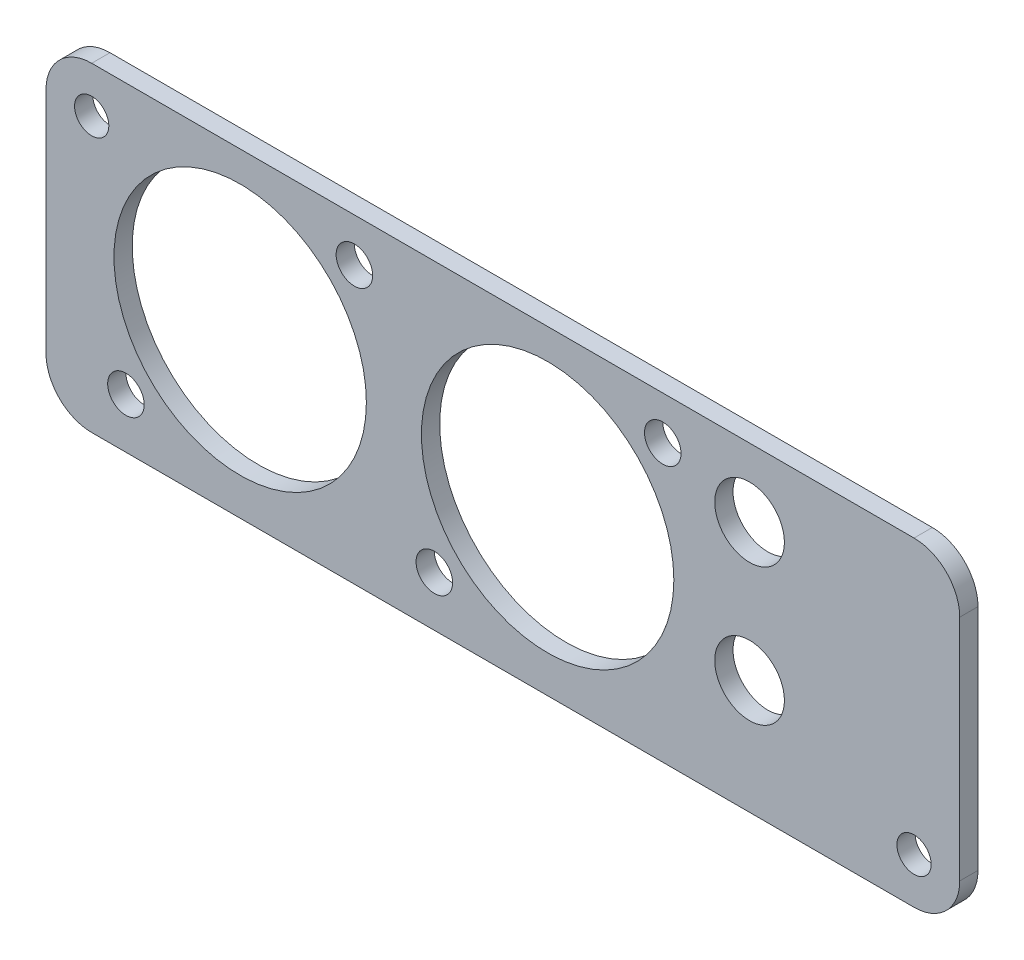
ISO-10303-21;
HEADER;
FILE_DESCRIPTION(('STEP AP214'),'2;1');
FILE_NAME('part.step','',(''),(''),'','','');
FILE_SCHEMA(('AUTOMOTIVE_DESIGN { 1 0 10303 214 1 1 1 1 }'));
ENDSEC;
DATA;
#1=APPLICATION_CONTEXT('core data for automotive mechanical design processes');
#2=APPLICATION_PROTOCOL_DEFINITION('international standard','automotive_design',2000,#1);
#3=PRODUCT_CONTEXT('',#1,'mechanical');
#4=PRODUCT('Part','Part','',(#3));
#5=PRODUCT_RELATED_PRODUCT_CATEGORY('part','',(#4));
#6=PRODUCT_DEFINITION_FORMATION('','',#4);
#7=PRODUCT_DEFINITION_CONTEXT('part definition',#1,'design');
#8=PRODUCT_DEFINITION('design','',#6,#7);
#9=PRODUCT_DEFINITION_SHAPE('','',#8);
#10=(LENGTH_UNIT() NAMED_UNIT(*) SI_UNIT(.MILLI.,.METRE.));
#11=(NAMED_UNIT(*) PLANE_ANGLE_UNIT() SI_UNIT($,.RADIAN.));
#12=(NAMED_UNIT(*) SI_UNIT($,.STERADIAN.) SOLID_ANGLE_UNIT());
#13=UNCERTAINTY_MEASURE_WITH_UNIT(LENGTH_MEASURE(1.E-05),#10,'distance_accuracy_value','');
#14=(GEOMETRIC_REPRESENTATION_CONTEXT(3) GLOBAL_UNCERTAINTY_ASSIGNED_CONTEXT((#13)) GLOBAL_UNIT_ASSIGNED_CONTEXT((#10,
#11,#12)) REPRESENTATION_CONTEXT('',''));
#15=CARTESIAN_POINT('',(0.,0.,0.));
#16=DIRECTION('',(0.,0.,1.));
#17=DIRECTION('',(1.,0.,0.));
#18=AXIS2_PLACEMENT_3D('',#15,#16,#17);
#19=CARTESIAN_POINT('',(-36.,-10.,1.6));
#20=DIRECTION('',(0.,0.,-1.));
#21=DIRECTION('',(-1.,0.,0.));
#22=AXIS2_PLACEMENT_3D('',#19,#20,#21);
#23=PLANE('',#22);
#24=CARTESIAN_POINT('',(-36.,-10.,1.6));
#25=DIRECTION('',(0.,0.,1.));
#26=DIRECTION('',(-1.,0.,0.));
#27=AXIS2_PLACEMENT_3D('',#24,#25,#26);
#28=CIRCLE('',#27,4.);
#29=CARTESIAN_POINT('',(-40.,-9.99999999999997,1.6));
#30=VERTEX_POINT('',#29);
#31=CARTESIAN_POINT('',(-36.,-14.,1.6));
#32=VERTEX_POINT('',#31);
#33=EDGE_CURVE('E151',#30,#32,#28,.T.);
#34=ORIENTED_EDGE('',*,*,#33,.T.);
#35=DIRECTION('',(1.,0.,0.));
#36=VECTOR('',#35,1.);
#37=CARTESIAN_POINT('',(-36.,-14.,1.6));
#38=LINE('',#37,#36);
#39=CARTESIAN_POINT('',(36.,-14.,1.6));
#40=VERTEX_POINT('',#39);
#41=EDGE_CURVE('E99',#32,#40,#38,.T.);
#42=ORIENTED_EDGE('',*,*,#41,.T.);
#43=CARTESIAN_POINT('',(36.,-10.,1.6));
#44=DIRECTION('',(0.,0.,1.));
#45=DIRECTION('',(1.,0.,0.));
#46=AXIS2_PLACEMENT_3D('',#43,#44,#45);
#47=CIRCLE('',#46,4.);
#48=CARTESIAN_POINT('',(40.,-10.,1.6));
#49=VERTEX_POINT('',#48);
#50=EDGE_CURVE('E166',#40,#49,#47,.T.);
#51=ORIENTED_EDGE('',*,*,#50,.T.);
#52=DIRECTION('',(0.,1.,0.));
#53=VECTOR('',#52,1.);
#54=CARTESIAN_POINT('',(40.,-9.99999999999997,1.6));
#55=LINE('',#54,#53);
#56=CARTESIAN_POINT('',(40.,9.99999999999997,1.6));
#57=VERTEX_POINT('',#56);
#58=EDGE_CURVE('E179',#49,#57,#55,.T.);
#59=ORIENTED_EDGE('',*,*,#58,.T.);
#60=CARTESIAN_POINT('',(36.,10.,1.6));
#61=DIRECTION('',(0.,0.,1.));
#62=DIRECTION('',(-1.,0.,0.));
#63=AXIS2_PLACEMENT_3D('',#60,#61,#62);
#64=CIRCLE('',#63,4.);
#65=CARTESIAN_POINT('',(36.,14.,1.6));
#66=VERTEX_POINT('',#65);
#67=EDGE_CURVE('E118',#57,#66,#64,.T.);
#68=ORIENTED_EDGE('',*,*,#67,.T.);
#69=DIRECTION('',(-1.,0.,0.));
#70=VECTOR('',#69,1.);
#71=CARTESIAN_POINT('',(-36.,14.,1.6));
#72=LINE('',#71,#70);
#73=CARTESIAN_POINT('',(-36.,14.,1.6));
#74=VERTEX_POINT('',#73);
#75=EDGE_CURVE('E112',#66,#74,#72,.T.);
#76=ORIENTED_EDGE('',*,*,#75,.T.);
#77=CARTESIAN_POINT('',(-36.,10.,1.6));
#78=DIRECTION('',(0.,0.,1.));
#79=DIRECTION('',(-1.,0.,0.));
#80=AXIS2_PLACEMENT_3D('',#77,#78,#79);
#81=CIRCLE('',#80,4.);
#82=CARTESIAN_POINT('',(-40.,9.99999999999997,1.6));
#83=VERTEX_POINT('',#82);
#84=EDGE_CURVE('E116',#74,#83,#81,.T.);
#85=ORIENTED_EDGE('',*,*,#84,.T.);
#86=DIRECTION('',(0.,-1.,0.));
#87=VECTOR('',#86,1.);
#88=CARTESIAN_POINT('',(-40.,-9.99999999999997,1.6));
#89=LINE('',#88,#87);
#90=EDGE_CURVE('E56',#83,#30,#89,.T.);
#91=ORIENTED_EDGE('',*,*,#90,.T.);
#92=EDGE_LOOP('',(#34,#42,#51,#59,#68,#76,#85,#91));
#93=FACE_BOUND('',#92,.T.);
#94=CARTESIAN_POINT('',(-23.,0.300000000000002,1.6));
#95=DIRECTION('',(0.,0.,1.));
#96=DIRECTION('',(1.,0.,0.));
#97=AXIS2_PLACEMENT_3D('',#94,#95,#96);
#98=CIRCLE('',#97,11.05);
#99=CARTESIAN_POINT('',(-11.95,0.300000000000002,1.6));
#100=VERTEX_POINT('',#99);
#101=EDGE_CURVE('E140',#100,#100,#98,.T.);
#102=ORIENTED_EDGE('',*,*,#101,.F.);
#103=EDGE_LOOP('',(#102));
#104=FACE_BOUND('',#103,.T.);
#105=CARTESIAN_POINT('',(3.91999999999999,0.300000000000002,1.6));
#106=DIRECTION('',(0.,0.,1.));
#107=DIRECTION('',(1.,0.,0.));
#108=AXIS2_PLACEMENT_3D('',#105,#106,#107);
#109=CIRCLE('',#108,11.05);
#110=CARTESIAN_POINT('',(14.97,0.300000000000002,1.6));
#111=VERTEX_POINT('',#110);
#112=EDGE_CURVE('E188',#111,#111,#109,.T.);
#113=ORIENTED_EDGE('',*,*,#112,.F.);
#114=EDGE_LOOP('',(#113));
#115=FACE_BOUND('',#114,.T.);
#116=CARTESIAN_POINT('',(14.,10.2,1.6));
#117=DIRECTION('',(0.,0.,1.));
#118=DIRECTION('',(1.,0.,0.));
#119=AXIS2_PLACEMENT_3D('',#116,#117,#118);
#120=CIRCLE('',#119,1.6);
#121=CARTESIAN_POINT('',(15.6,10.2,1.6));
#122=VERTEX_POINT('',#121);
#123=EDGE_CURVE('E194',#122,#122,#120,.T.);
#124=ORIENTED_EDGE('',*,*,#123,.F.);
#125=EDGE_LOOP('',(#124));
#126=FACE_BOUND('',#125,.T.);
#127=CARTESIAN_POINT('',(-6.00000000000001,-9.6,1.6));
#128=DIRECTION('',(0.,0.,1.));
#129=DIRECTION('',(1.,0.,0.));
#130=AXIS2_PLACEMENT_3D('',#127,#128,#129);
#131=CIRCLE('',#130,1.6);
#132=CARTESIAN_POINT('',(-4.40000000000001,-9.6,1.6));
#133=VERTEX_POINT('',#132);
#134=EDGE_CURVE('E200',#133,#133,#131,.T.);
#135=ORIENTED_EDGE('',*,*,#134,.F.);
#136=EDGE_LOOP('',(#135));
#137=FACE_BOUND('',#136,.T.);
#138=CARTESIAN_POINT('',(-33.,-9.60000000000001,1.6));
#139=DIRECTION('',(0.,0.,1.));
#140=DIRECTION('',(1.,0.,0.));
#141=AXIS2_PLACEMENT_3D('',#138,#139,#140);
#142=CIRCLE('',#141,1.6);
#143=CARTESIAN_POINT('',(-31.4,-9.60000000000001,1.6));
#144=VERTEX_POINT('',#143);
#145=EDGE_CURVE('E206',#144,#144,#142,.T.);
#146=ORIENTED_EDGE('',*,*,#145,.F.);
#147=EDGE_LOOP('',(#146));
#148=FACE_BOUND('',#147,.T.);
#149=CARTESIAN_POINT('',(-13.,10.2,1.6));
#150=DIRECTION('',(0.,0.,1.));
#151=DIRECTION('',(1.,0.,0.));
#152=AXIS2_PLACEMENT_3D('',#149,#150,#151);
#153=CIRCLE('',#152,1.6);
#154=CARTESIAN_POINT('',(-11.4,10.2,1.6));
#155=VERTEX_POINT('',#154);
#156=EDGE_CURVE('E212',#155,#155,#153,.T.);
#157=ORIENTED_EDGE('',*,*,#156,.F.);
#158=EDGE_LOOP('',(#157));
#159=FACE_BOUND('',#158,.T.);
#160=CARTESIAN_POINT('',(-36.,10.,1.6));
#161=DIRECTION('',(0.,0.,1.));
#162=DIRECTION('',(1.,0.,0.));
#163=AXIS2_PLACEMENT_3D('',#160,#161,#162);
#164=CIRCLE('',#163,1.5);
#165=CARTESIAN_POINT('',(-34.5,10.,1.6));
#166=VERTEX_POINT('',#165);
#167=EDGE_CURVE('E218',#166,#166,#164,.T.);
#168=ORIENTED_EDGE('',*,*,#167,.F.);
#169=EDGE_LOOP('',(#168));
#170=FACE_BOUND('',#169,.T.);
#171=CARTESIAN_POINT('',(21.6,8.,1.6));
#172=DIRECTION('',(0.,0.,1.));
#173=DIRECTION('',(1.,0.,0.));
#174=AXIS2_PLACEMENT_3D('',#171,#172,#173);
#175=CIRCLE('',#174,3.05);
#176=CARTESIAN_POINT('',(24.65,8.,1.6));
#177=VERTEX_POINT('',#176);
#178=EDGE_CURVE('E224',#177,#177,#175,.T.);
#179=ORIENTED_EDGE('',*,*,#178,.F.);
#180=EDGE_LOOP('',(#179));
#181=FACE_BOUND('',#180,.T.);
#182=CARTESIAN_POINT('',(21.6,-4.,1.6));
#183=DIRECTION('',(0.,0.,1.));
#184=DIRECTION('',(1.,0.,0.));
#185=AXIS2_PLACEMENT_3D('',#182,#183,#184);
#186=CIRCLE('',#185,3.05);
#187=CARTESIAN_POINT('',(24.65,-4.,1.6));
#188=VERTEX_POINT('',#187);
#189=EDGE_CURVE('E230',#188,#188,#186,.T.);
#190=ORIENTED_EDGE('',*,*,#189,.F.);
#191=EDGE_LOOP('',(#190));
#192=FACE_BOUND('',#191,.T.);
#193=CARTESIAN_POINT('',(36.,-10.,1.6));
#194=DIRECTION('',(0.,0.,1.));
#195=DIRECTION('',(1.,0.,0.));
#196=AXIS2_PLACEMENT_3D('',#193,#194,#195);
#197=CIRCLE('',#196,1.5);
#198=CARTESIAN_POINT('',(37.5,-10.,1.6));
#199=VERTEX_POINT('',#198);
#200=EDGE_CURVE('E236',#199,#199,#197,.T.);
#201=ORIENTED_EDGE('',*,*,#200,.F.);
#202=EDGE_LOOP('',(#201));
#203=FACE_BOUND('',#202,.T.);
#204=ADVANCED_FACE('F39',(#93,#104,#115,#126,#137,#148,#159,#170,#181,#192,#203),#23,.F.);
#205=CARTESIAN_POINT('',(-36.,-10.,0.));
#206=DIRECTION('',(0.,0.,-1.));
#207=DIRECTION('',(-1.,0.,0.));
#208=AXIS2_PLACEMENT_3D('',#205,#206,#207);
#209=PLANE('',#208);
#210=CARTESIAN_POINT('',(21.6,-4.,0.));
#211=DIRECTION('',(0.,0.,1.));
#212=DIRECTION('',(1.,0.,0.));
#213=AXIS2_PLACEMENT_3D('',#210,#211,#212);
#214=CIRCLE('',#213,3.05);
#215=CARTESIAN_POINT('',(24.65,-4.,0.));
#216=VERTEX_POINT('',#215);
#217=EDGE_CURVE('E233',#216,#216,#214,.T.);
#218=ORIENTED_EDGE('',*,*,#217,.T.);
#219=EDGE_LOOP('',(#218));
#220=FACE_BOUND('',#219,.T.);
#221=CARTESIAN_POINT('',(-36.,10.,0.));
#222=DIRECTION('',(0.,0.,1.));
#223=DIRECTION('',(1.,0.,0.));
#224=AXIS2_PLACEMENT_3D('',#221,#222,#223);
#225=CIRCLE('',#224,1.5);
#226=CARTESIAN_POINT('',(-34.5,10.,0.));
#227=VERTEX_POINT('',#226);
#228=EDGE_CURVE('E221',#227,#227,#225,.T.);
#229=ORIENTED_EDGE('',*,*,#228,.T.);
#230=EDGE_LOOP('',(#229));
#231=FACE_BOUND('',#230,.T.);
#232=CARTESIAN_POINT('',(-33.,-9.60000000000001,0.));
#233=DIRECTION('',(0.,0.,1.));
#234=DIRECTION('',(1.,0.,0.));
#235=AXIS2_PLACEMENT_3D('',#232,#233,#234);
#236=CIRCLE('',#235,1.6);
#237=CARTESIAN_POINT('',(-31.4,-9.60000000000001,0.));
#238=VERTEX_POINT('',#237);
#239=EDGE_CURVE('E209',#238,#238,#236,.T.);
#240=ORIENTED_EDGE('',*,*,#239,.T.);
#241=EDGE_LOOP('',(#240));
#242=FACE_BOUND('',#241,.T.);
#243=CARTESIAN_POINT('',(14.,10.2,0.));
#244=DIRECTION('',(0.,0.,1.));
#245=DIRECTION('',(1.,0.,0.));
#246=AXIS2_PLACEMENT_3D('',#243,#244,#245);
#247=CIRCLE('',#246,1.6);
#248=CARTESIAN_POINT('',(15.6,10.2,0.));
#249=VERTEX_POINT('',#248);
#250=EDGE_CURVE('E197',#249,#249,#247,.T.);
#251=ORIENTED_EDGE('',*,*,#250,.T.);
#252=EDGE_LOOP('',(#251));
#253=FACE_BOUND('',#252,.T.);
#254=CARTESIAN_POINT('',(-23.,0.300000000000002,0.));
#255=DIRECTION('',(0.,0.,1.));
#256=DIRECTION('',(1.,0.,0.));
#257=AXIS2_PLACEMENT_3D('',#254,#255,#256);
#258=CIRCLE('',#257,11.05);
#259=CARTESIAN_POINT('',(-11.95,0.300000000000002,0.));
#260=VERTEX_POINT('',#259);
#261=EDGE_CURVE('E185',#260,#260,#258,.T.);
#262=ORIENTED_EDGE('',*,*,#261,.T.);
#263=EDGE_LOOP('',(#262));
#264=FACE_BOUND('',#263,.T.);
#265=CARTESIAN_POINT('',(-36.,-10.,0.));
#266=DIRECTION('',(0.,0.,1.));
#267=DIRECTION('',(-1.,0.,0.));
#268=AXIS2_PLACEMENT_3D('',#265,#266,#267);
#269=CIRCLE('',#268,4.);
#270=CARTESIAN_POINT('',(-40.,-9.99999999999997,0.));
#271=VERTEX_POINT('',#270);
#272=CARTESIAN_POINT('',(-36.,-14.,0.));
#273=VERTEX_POINT('',#272);
#274=EDGE_CURVE('E136',#271,#273,#269,.T.);
#275=ORIENTED_EDGE('',*,*,#274,.F.);
#276=DIRECTION('',(0.,-1.,0.));
#277=VECTOR('',#276,1.);
#278=CARTESIAN_POINT('',(-40.,-9.99999999999997,0.));
#279=LINE('',#278,#277);
#280=CARTESIAN_POINT('',(-40.,9.99999999999997,0.));
#281=VERTEX_POINT('',#280);
#282=EDGE_CURVE('E91',#281,#271,#279,.T.);
#283=ORIENTED_EDGE('',*,*,#282,.F.);
#284=CARTESIAN_POINT('',(-36.,10.,0.));
#285=DIRECTION('',(0.,0.,1.));
#286=DIRECTION('',(-1.,0.,0.));
#287=AXIS2_PLACEMENT_3D('',#284,#285,#286);
#288=CIRCLE('',#287,4.);
#289=CARTESIAN_POINT('',(-36.,14.,0.));
#290=VERTEX_POINT('',#289);
#291=EDGE_CURVE('E85',#290,#281,#288,.T.);
#292=ORIENTED_EDGE('',*,*,#291,.F.);
#293=DIRECTION('',(-1.,0.,0.));
#294=VECTOR('',#293,1.);
#295=CARTESIAN_POINT('',(-36.,14.,0.));
#296=LINE('',#295,#294);
#297=CARTESIAN_POINT('',(36.,14.,0.));
#298=VERTEX_POINT('',#297);
#299=EDGE_CURVE('E126',#298,#290,#296,.T.);
#300=ORIENTED_EDGE('',*,*,#299,.F.);
#301=CARTESIAN_POINT('',(36.,10.,0.));
#302=DIRECTION('',(0.,0.,1.));
#303=DIRECTION('',(-1.,0.,0.));
#304=AXIS2_PLACEMENT_3D('',#301,#302,#303);
#305=CIRCLE('',#304,4.);
#306=CARTESIAN_POINT('',(40.,9.99999999999997,0.));
#307=VERTEX_POINT('',#306);
#308=EDGE_CURVE('E146',#307,#298,#305,.T.);
#309=ORIENTED_EDGE('',*,*,#308,.F.);
#310=DIRECTION('',(0.,1.,0.));
#311=VECTOR('',#310,1.);
#312=CARTESIAN_POINT('',(40.,-9.99999999999997,0.));
#313=LINE('',#312,#311);
#314=CARTESIAN_POINT('',(40.,-10.,0.));
#315=VERTEX_POINT('',#314);
#316=EDGE_CURVE('E144',#315,#307,#313,.T.);
#317=ORIENTED_EDGE('',*,*,#316,.F.);
#318=CARTESIAN_POINT('',(36.,-10.,0.));
#319=DIRECTION('',(0.,0.,1.));
#320=DIRECTION('',(1.,0.,0.));
#321=AXIS2_PLACEMENT_3D('',#318,#319,#320);
#322=CIRCLE('',#321,4.);
#323=CARTESIAN_POINT('',(36.,-14.,0.));
#324=VERTEX_POINT('',#323);
#325=EDGE_CURVE('E142',#324,#315,#322,.T.);
#326=ORIENTED_EDGE('',*,*,#325,.F.);
#327=DIRECTION('',(1.,0.,0.));
#328=VECTOR('',#327,1.);
#329=CARTESIAN_POINT('',(-36.,-14.,0.));
#330=LINE('',#329,#328);
#331=EDGE_CURVE('E139',#273,#324,#330,.T.);
#332=ORIENTED_EDGE('',*,*,#331,.F.);
#333=EDGE_LOOP('',(#275,#283,#292,#300,#309,#317,#326,#332));
#334=FACE_BOUND('',#333,.T.);
#335=CARTESIAN_POINT('',(3.91999999999999,0.300000000000002,0.));
#336=DIRECTION('',(0.,0.,1.));
#337=DIRECTION('',(1.,0.,0.));
#338=AXIS2_PLACEMENT_3D('',#335,#336,#337);
#339=CIRCLE('',#338,11.05);
#340=CARTESIAN_POINT('',(14.97,0.300000000000002,0.));
#341=VERTEX_POINT('',#340);
#342=EDGE_CURVE('E191',#341,#341,#339,.T.);
#343=ORIENTED_EDGE('',*,*,#342,.T.);
#344=EDGE_LOOP('',(#343));
#345=FACE_BOUND('',#344,.T.);
#346=CARTESIAN_POINT('',(-6.00000000000001,-9.6,0.));
#347=DIRECTION('',(0.,0.,1.));
#348=DIRECTION('',(1.,0.,0.));
#349=AXIS2_PLACEMENT_3D('',#346,#347,#348);
#350=CIRCLE('',#349,1.6);
#351=CARTESIAN_POINT('',(-4.40000000000001,-9.6,0.));
#352=VERTEX_POINT('',#351);
#353=EDGE_CURVE('E203',#352,#352,#350,.T.);
#354=ORIENTED_EDGE('',*,*,#353,.T.);
#355=EDGE_LOOP('',(#354));
#356=FACE_BOUND('',#355,.T.);
#357=CARTESIAN_POINT('',(-13.,10.2,0.));
#358=DIRECTION('',(0.,0.,1.));
#359=DIRECTION('',(1.,0.,0.));
#360=AXIS2_PLACEMENT_3D('',#357,#358,#359);
#361=CIRCLE('',#360,1.6);
#362=CARTESIAN_POINT('',(-11.4,10.2,0.));
#363=VERTEX_POINT('',#362);
#364=EDGE_CURVE('E215',#363,#363,#361,.T.);
#365=ORIENTED_EDGE('',*,*,#364,.T.);
#366=EDGE_LOOP('',(#365));
#367=FACE_BOUND('',#366,.T.);
#368=CARTESIAN_POINT('',(21.6,8.,0.));
#369=DIRECTION('',(0.,0.,1.));
#370=DIRECTION('',(1.,0.,0.));
#371=AXIS2_PLACEMENT_3D('',#368,#369,#370);
#372=CIRCLE('',#371,3.05);
#373=CARTESIAN_POINT('',(24.65,8.,0.));
#374=VERTEX_POINT('',#373);
#375=EDGE_CURVE('E227',#374,#374,#372,.T.);
#376=ORIENTED_EDGE('',*,*,#375,.T.);
#377=EDGE_LOOP('',(#376));
#378=FACE_BOUND('',#377,.T.);
#379=CARTESIAN_POINT('',(36.,-10.,0.));
#380=DIRECTION('',(0.,0.,1.));
#381=DIRECTION('',(1.,0.,0.));
#382=AXIS2_PLACEMENT_3D('',#379,#380,#381);
#383=CIRCLE('',#382,1.5);
#384=CARTESIAN_POINT('',(37.5,-10.,0.));
#385=VERTEX_POINT('',#384);
#386=EDGE_CURVE('E239',#385,#385,#383,.T.);
#387=ORIENTED_EDGE('',*,*,#386,.T.);
#388=EDGE_LOOP('',(#387));
#389=FACE_BOUND('',#388,.T.);
#390=ADVANCED_FACE('F170',(#220,#231,#242,#253,#264,#334,#345,#356,#367,#378,#389),#209,.T.);
#391=CARTESIAN_POINT('',(-36.,-10.,1.6));
#392=DIRECTION('',(0.,0.,-1.));
#393=DIRECTION('',(-1.,0.,0.));
#394=AXIS2_PLACEMENT_3D('',#391,#392,#393);
#395=CYLINDRICAL_SURFACE('',#394,4.);
#396=ORIENTED_EDGE('',*,*,#274,.T.);
#397=DIRECTION('',(0.,0.,-1.));
#398=VECTOR('',#397,1.);
#399=CARTESIAN_POINT('',(-36.,-14.,1.6));
#400=LINE('',#399,#398);
#401=EDGE_CURVE('E11',#32,#273,#400,.T.);
#402=ORIENTED_EDGE('',*,*,#401,.F.);
#403=ORIENTED_EDGE('',*,*,#33,.F.);
#404=DIRECTION('',(0.,0.,-1.));
#405=VECTOR('',#404,1.);
#406=CARTESIAN_POINT('',(-40.,-9.99999999999997,1.6));
#407=LINE('',#406,#405);
#408=EDGE_CURVE('E132',#30,#271,#407,.T.);
#409=ORIENTED_EDGE('',*,*,#408,.T.);
#410=EDGE_LOOP('',(#396,#402,#403,#409));
#411=FACE_BOUND('',#410,.T.);
#412=ADVANCED_FACE('F41',(#411),#395,.T.);
#413=CARTESIAN_POINT('',(-36.,-14.,1.6));
#414=DIRECTION('',(0.,1.,0.));
#415=DIRECTION('',(0.,0.,1.));
#416=AXIS2_PLACEMENT_3D('',#413,#414,#415);
#417=PLANE('',#416);
#418=ORIENTED_EDGE('',*,*,#331,.T.);
#419=DIRECTION('',(0.,0.,-1.));
#420=VECTOR('',#419,1.);
#421=CARTESIAN_POINT('',(36.,-14.,1.6));
#422=LINE('',#421,#420);
#423=EDGE_CURVE('E48',#40,#324,#422,.T.);
#424=ORIENTED_EDGE('',*,*,#423,.F.);
#425=ORIENTED_EDGE('',*,*,#41,.F.);
#426=ORIENTED_EDGE('',*,*,#401,.T.);
#427=EDGE_LOOP('',(#418,#424,#425,#426));
#428=FACE_BOUND('',#427,.T.);
#429=ADVANCED_FACE('F271',(#428),#417,.F.);
#430=CARTESIAN_POINT('',(36.,-10.,1.6));
#431=DIRECTION('',(0.,0.,-1.));
#432=DIRECTION('',(-1.,0.,0.));
#433=AXIS2_PLACEMENT_3D('',#430,#431,#432);
#434=CYLINDRICAL_SURFACE('',#433,4.);
#435=ORIENTED_EDGE('',*,*,#325,.T.);
#436=DIRECTION('',(0.,0.,-1.));
#437=VECTOR('',#436,1.);
#438=CARTESIAN_POINT('',(40.,-10.,1.6));
#439=LINE('',#438,#437);
#440=EDGE_CURVE('E158',#49,#315,#439,.T.);
#441=ORIENTED_EDGE('',*,*,#440,.F.);
#442=ORIENTED_EDGE('',*,*,#50,.F.);
#443=ORIENTED_EDGE('',*,*,#423,.T.);
#444=EDGE_LOOP('',(#435,#441,#442,#443));
#445=FACE_BOUND('',#444,.T.);
#446=ADVANCED_FACE('F164',(#445),#434,.T.);
#447=CARTESIAN_POINT('',(40.,-9.99999999999997,1.6));
#448=DIRECTION('',(-1.,0.,0.));
#449=DIRECTION('',(0.,0.,1.));
#450=AXIS2_PLACEMENT_3D('',#447,#448,#449);
#451=PLANE('',#450);
#452=ORIENTED_EDGE('',*,*,#316,.T.);
#453=DIRECTION('',(0.,0.,-1.));
#454=VECTOR('',#453,1.);
#455=CARTESIAN_POINT('',(40.,9.99999999999997,1.6));
#456=LINE('',#455,#454);
#457=EDGE_CURVE('E155',#57,#307,#456,.T.);
#458=ORIENTED_EDGE('',*,*,#457,.F.);
#459=ORIENTED_EDGE('',*,*,#58,.F.);
#460=ORIENTED_EDGE('',*,*,#440,.T.);
#461=EDGE_LOOP('',(#452,#458,#459,#460));
#462=FACE_BOUND('',#461,.T.);
#463=ADVANCED_FACE('F175',(#462),#451,.F.);
#464=CARTESIAN_POINT('',(36.,10.,1.6));
#465=DIRECTION('',(0.,0.,-1.));
#466=DIRECTION('',(-1.,0.,0.));
#467=AXIS2_PLACEMENT_3D('',#464,#465,#466);
#468=CYLINDRICAL_SURFACE('',#467,4.);
#469=ORIENTED_EDGE('',*,*,#308,.T.);
#470=DIRECTION('',(0.,0.,-1.));
#471=VECTOR('',#470,1.);
#472=CARTESIAN_POINT('',(36.,14.,1.6));
#473=LINE('',#472,#471);
#474=EDGE_CURVE('E127',#66,#298,#473,.T.);
#475=ORIENTED_EDGE('',*,*,#474,.F.);
#476=ORIENTED_EDGE('',*,*,#67,.F.);
#477=ORIENTED_EDGE('',*,*,#457,.T.);
#478=EDGE_LOOP('',(#469,#475,#476,#477));
#479=FACE_BOUND('',#478,.T.);
#480=ADVANCED_FACE('F178',(#479),#468,.T.);
#481=CARTESIAN_POINT('',(-36.,14.,1.6));
#482=DIRECTION('',(0.,-1.,0.));
#483=DIRECTION('',(0.,0.,-1.));
#484=AXIS2_PLACEMENT_3D('',#481,#482,#483);
#485=PLANE('',#484);
#486=ORIENTED_EDGE('',*,*,#299,.T.);
#487=DIRECTION('',(0.,0.,-1.));
#488=VECTOR('',#487,1.);
#489=CARTESIAN_POINT('',(-36.,14.,1.6));
#490=LINE('',#489,#488);
#491=EDGE_CURVE('E123',#74,#290,#490,.T.);
#492=ORIENTED_EDGE('',*,*,#491,.F.);
#493=ORIENTED_EDGE('',*,*,#75,.F.);
#494=ORIENTED_EDGE('',*,*,#474,.T.);
#495=EDGE_LOOP('',(#486,#492,#493,#494));
#496=FACE_BOUND('',#495,.T.);
#497=ADVANCED_FACE('F124',(#496),#485,.F.);
#498=CARTESIAN_POINT('',(-36.,10.,1.6));
#499=DIRECTION('',(0.,0.,-1.));
#500=DIRECTION('',(-1.,0.,0.));
#501=AXIS2_PLACEMENT_3D('',#498,#499,#500);
#502=CYLINDRICAL_SURFACE('',#501,4.);
#503=ORIENTED_EDGE('',*,*,#291,.T.);
#504=DIRECTION('',(0.,0.,-1.));
#505=VECTOR('',#504,1.);
#506=CARTESIAN_POINT('',(-40.,9.99999999999997,1.6));
#507=LINE('',#506,#505);
#508=EDGE_CURVE('E128',#83,#281,#507,.T.);
#509=ORIENTED_EDGE('',*,*,#508,.F.);
#510=ORIENTED_EDGE('',*,*,#84,.F.);
#511=ORIENTED_EDGE('',*,*,#491,.T.);
#512=EDGE_LOOP('',(#503,#509,#510,#511));
#513=FACE_BOUND('',#512,.T.);
#514=ADVANCED_FACE('F130',(#513),#502,.T.);
#515=CARTESIAN_POINT('',(-40.,-9.99999999999997,1.6));
#516=DIRECTION('',(1.,0.,0.));
#517=DIRECTION('',(0.,0.,-1.));
#518=AXIS2_PLACEMENT_3D('',#515,#516,#517);
#519=PLANE('',#518);
#520=ORIENTED_EDGE('',*,*,#282,.T.);
#521=ORIENTED_EDGE('',*,*,#408,.F.);
#522=ORIENTED_EDGE('',*,*,#90,.F.);
#523=ORIENTED_EDGE('',*,*,#508,.T.);
#524=EDGE_LOOP('',(#520,#521,#522,#523));
#525=FACE_BOUND('',#524,.T.);
#526=ADVANCED_FACE('F259',(#525),#519,.F.);
#527=CARTESIAN_POINT('',(-23.,0.300000000000002,1.6));
#528=DIRECTION('',(0.,0.,-1.));
#529=DIRECTION('',(-1.,0.,0.));
#530=AXIS2_PLACEMENT_3D('',#527,#528,#529);
#531=CYLINDRICAL_SURFACE('',#530,11.05);
#532=ORIENTED_EDGE('',*,*,#101,.T.);
#533=EDGE_LOOP('',(#532));
#534=FACE_BOUND('',#533,.T.);
#535=ORIENTED_EDGE('',*,*,#261,.F.);
#536=EDGE_LOOP('',(#535));
#537=FACE_BOUND('',#536,.T.);
#538=ADVANCED_FACE('F256',(#534,#537),#531,.F.);
#539=CARTESIAN_POINT('',(3.91999999999999,0.300000000000002,1.6));
#540=DIRECTION('',(0.,0.,-1.));
#541=DIRECTION('',(-1.,0.,0.));
#542=AXIS2_PLACEMENT_3D('',#539,#540,#541);
#543=CYLINDRICAL_SURFACE('',#542,11.05);
#544=ORIENTED_EDGE('',*,*,#112,.T.);
#545=EDGE_LOOP('',(#544));
#546=FACE_BOUND('',#545,.T.);
#547=ORIENTED_EDGE('',*,*,#342,.F.);
#548=EDGE_LOOP('',(#547));
#549=FACE_BOUND('',#548,.T.);
#550=ADVANCED_FACE('F339',(#546,#549),#543,.F.);
#551=CARTESIAN_POINT('',(14.,10.2,1.6));
#552=DIRECTION('',(0.,0.,-1.));
#553=DIRECTION('',(-1.,0.,0.));
#554=AXIS2_PLACEMENT_3D('',#551,#552,#553);
#555=CYLINDRICAL_SURFACE('',#554,1.6);
#556=ORIENTED_EDGE('',*,*,#123,.T.);
#557=EDGE_LOOP('',(#556));
#558=FACE_BOUND('',#557,.T.);
#559=ORIENTED_EDGE('',*,*,#250,.F.);
#560=EDGE_LOOP('',(#559));
#561=FACE_BOUND('',#560,.T.);
#562=ADVANCED_FACE('F347',(#558,#561),#555,.F.);
#563=CARTESIAN_POINT('',(-6.00000000000001,-9.6,1.6));
#564=DIRECTION('',(0.,0.,-1.));
#565=DIRECTION('',(-1.,0.,0.));
#566=AXIS2_PLACEMENT_3D('',#563,#564,#565);
#567=CYLINDRICAL_SURFACE('',#566,1.6);
#568=ORIENTED_EDGE('',*,*,#134,.T.);
#569=EDGE_LOOP('',(#568));
#570=FACE_BOUND('',#569,.T.);
#571=ORIENTED_EDGE('',*,*,#353,.F.);
#572=EDGE_LOOP('',(#571));
#573=FACE_BOUND('',#572,.T.);
#574=ADVANCED_FACE('F355',(#570,#573),#567,.F.);
#575=CARTESIAN_POINT('',(-33.,-9.60000000000001,1.6));
#576=DIRECTION('',(0.,0.,-1.));
#577=DIRECTION('',(-1.,0.,0.));
#578=AXIS2_PLACEMENT_3D('',#575,#576,#577);
#579=CYLINDRICAL_SURFACE('',#578,1.6);
#580=ORIENTED_EDGE('',*,*,#145,.T.);
#581=EDGE_LOOP('',(#580));
#582=FACE_BOUND('',#581,.T.);
#583=ORIENTED_EDGE('',*,*,#239,.F.);
#584=EDGE_LOOP('',(#583));
#585=FACE_BOUND('',#584,.T.);
#586=ADVANCED_FACE('F364',(#582,#585),#579,.F.);
#587=CARTESIAN_POINT('',(-13.,10.2,1.6));
#588=DIRECTION('',(0.,0.,-1.));
#589=DIRECTION('',(-1.,0.,0.));
#590=AXIS2_PLACEMENT_3D('',#587,#588,#589);
#591=CYLINDRICAL_SURFACE('',#590,1.6);
#592=ORIENTED_EDGE('',*,*,#156,.T.);
#593=EDGE_LOOP('',(#592));
#594=FACE_BOUND('',#593,.T.);
#595=ORIENTED_EDGE('',*,*,#364,.F.);
#596=EDGE_LOOP('',(#595));
#597=FACE_BOUND('',#596,.T.);
#598=ADVANCED_FACE('F373',(#594,#597),#591,.F.);
#599=CARTESIAN_POINT('',(-36.,10.,1.6));
#600=DIRECTION('',(0.,0.,-1.));
#601=DIRECTION('',(-1.,0.,0.));
#602=AXIS2_PLACEMENT_3D('',#599,#600,#601);
#603=CYLINDRICAL_SURFACE('',#602,1.5);
#604=ORIENTED_EDGE('',*,*,#167,.T.);
#605=EDGE_LOOP('',(#604));
#606=FACE_BOUND('',#605,.T.);
#607=ORIENTED_EDGE('',*,*,#228,.F.);
#608=EDGE_LOOP('',(#607));
#609=FACE_BOUND('',#608,.T.);
#610=ADVANCED_FACE('F382',(#606,#609),#603,.F.);
#611=CARTESIAN_POINT('',(21.6,8.,1.6));
#612=DIRECTION('',(0.,0.,-1.));
#613=DIRECTION('',(-1.,0.,0.));
#614=AXIS2_PLACEMENT_3D('',#611,#612,#613);
#615=CYLINDRICAL_SURFACE('',#614,3.05);
#616=ORIENTED_EDGE('',*,*,#178,.T.);
#617=EDGE_LOOP('',(#616));
#618=FACE_BOUND('',#617,.T.);
#619=ORIENTED_EDGE('',*,*,#375,.F.);
#620=EDGE_LOOP('',(#619));
#621=FACE_BOUND('',#620,.T.);
#622=ADVANCED_FACE('F391',(#618,#621),#615,.F.);
#623=CARTESIAN_POINT('',(21.6,-4.,1.6));
#624=DIRECTION('',(0.,0.,-1.));
#625=DIRECTION('',(-1.,0.,0.));
#626=AXIS2_PLACEMENT_3D('',#623,#624,#625);
#627=CYLINDRICAL_SURFACE('',#626,3.05);
#628=ORIENTED_EDGE('',*,*,#189,.T.);
#629=EDGE_LOOP('',(#628));
#630=FACE_BOUND('',#629,.T.);
#631=ORIENTED_EDGE('',*,*,#217,.F.);
#632=EDGE_LOOP('',(#631));
#633=FACE_BOUND('',#632,.T.);
#634=ADVANCED_FACE('F400',(#630,#633),#627,.F.);
#635=CARTESIAN_POINT('',(36.,-10.,1.6));
#636=DIRECTION('',(0.,0.,-1.));
#637=DIRECTION('',(-1.,0.,0.));
#638=AXIS2_PLACEMENT_3D('',#635,#636,#637);
#639=CYLINDRICAL_SURFACE('',#638,1.5);
#640=ORIENTED_EDGE('',*,*,#200,.T.);
#641=EDGE_LOOP('',(#640));
#642=FACE_BOUND('',#641,.T.);
#643=ORIENTED_EDGE('',*,*,#386,.F.);
#644=EDGE_LOOP('',(#643));
#645=FACE_BOUND('',#644,.T.);
#646=ADVANCED_FACE('F245',(#642,#645),#639,.F.);
#647=CLOSED_SHELL('',(#204,#390,#412,#429,#446,#463,#480,#497,#514,#526,#538,#550,#562,#574,
#586,#598,#610,#622,#634,#646));
#648=MANIFOLD_SOLID_BREP('B2',#647);
#649=ADVANCED_BREP_SHAPE_REPRESENTATION('',(#18,#648),#14);
#650=SHAPE_DEFINITION_REPRESENTATION(#9,#649);
ENDSEC;
END-ISO-10303-21;
